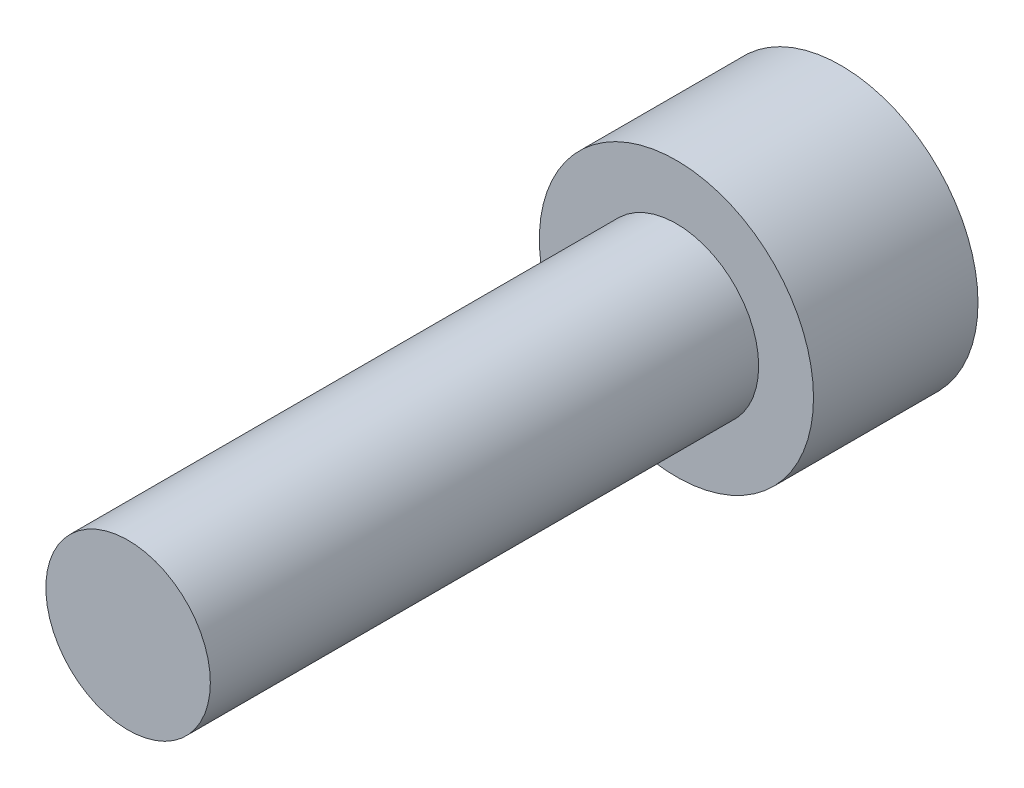
ISO-10303-21;
HEADER;
FILE_DESCRIPTION(('STEP AP214'),'2;1');
FILE_NAME('part.step','',(''),(''),'','','');
FILE_SCHEMA(('AUTOMOTIVE_DESIGN { 1 0 10303 214 1 1 1 1 }'));
ENDSEC;
DATA;
#1=APPLICATION_CONTEXT('core data for automotive mechanical design processes');
#2=APPLICATION_PROTOCOL_DEFINITION('international standard','automotive_design',2000,#1);
#3=PRODUCT_CONTEXT('',#1,'mechanical');
#4=PRODUCT('Part','Part','',(#3));
#5=PRODUCT_RELATED_PRODUCT_CATEGORY('part','',(#4));
#6=PRODUCT_DEFINITION_FORMATION('','',#4);
#7=PRODUCT_DEFINITION_CONTEXT('part definition',#1,'design');
#8=PRODUCT_DEFINITION('design','',#6,#7);
#9=PRODUCT_DEFINITION_SHAPE('','',#8);
#10=(LENGTH_UNIT() NAMED_UNIT(*) SI_UNIT(.MILLI.,.METRE.));
#11=(NAMED_UNIT(*) PLANE_ANGLE_UNIT() SI_UNIT($,.RADIAN.));
#12=(NAMED_UNIT(*) SI_UNIT($,.STERADIAN.) SOLID_ANGLE_UNIT());
#13=UNCERTAINTY_MEASURE_WITH_UNIT(LENGTH_MEASURE(1.E-05),#10,'distance_accuracy_value','');
#14=(GEOMETRIC_REPRESENTATION_CONTEXT(3) GLOBAL_UNCERTAINTY_ASSIGNED_CONTEXT((#13)) GLOBAL_UNIT_ASSIGNED_CONTEXT((#10,
#11,#12)) REPRESENTATION_CONTEXT('',''));
#15=CARTESIAN_POINT('',(0.,0.,0.));
#16=DIRECTION('',(0.,0.,1.));
#17=DIRECTION('',(1.,0.,0.));
#18=AXIS2_PLACEMENT_3D('',#15,#16,#17);
#19=CARTESIAN_POINT('',(0.,0.,6.));
#20=DIRECTION('',(0.,0.,1.));
#21=DIRECTION('',(1.,0.,0.));
#22=AXIS2_PLACEMENT_3D('',#19,#20,#21);
#23=PLANE('',#22);
#24=CARTESIAN_POINT('',(0.,0.,6.));
#25=DIRECTION('',(0.,0.,1.));
#26=DIRECTION('',(1.,0.,0.));
#27=AXIS2_PLACEMENT_3D('',#24,#25,#26);
#28=CIRCLE('',#27,5.);
#29=CARTESIAN_POINT('',(5.,0.,6.));
#30=VERTEX_POINT('',#29);
#31=EDGE_CURVE('E11',#30,#30,#28,.T.);
#32=ORIENTED_EDGE('',*,*,#31,.T.);
#33=EDGE_LOOP('',(#32));
#34=FACE_BOUND('',#33,.T.);
#35=CARTESIAN_POINT('',(0.,0.,6.));
#36=DIRECTION('',(0.,0.,1.));
#37=DIRECTION('',(1.,0.,0.));
#38=AXIS2_PLACEMENT_3D('',#35,#36,#37);
#39=CIRCLE('',#38,3.);
#40=CARTESIAN_POINT('',(3.,0.,6.));
#41=VERTEX_POINT('',#40);
#42=EDGE_CURVE('E139',#41,#41,#39,.T.);
#43=ORIENTED_EDGE('',*,*,#42,.F.);
#44=EDGE_LOOP('',(#43));
#45=FACE_BOUND('',#44,.T.);
#46=ADVANCED_FACE('F37',(#34,#45),#23,.T.);
#47=CARTESIAN_POINT('',(0.,0.,6.));
#48=DIRECTION('',(0.,0.,-1.));
#49=DIRECTION('',(-1.,0.,0.));
#50=AXIS2_PLACEMENT_3D('',#47,#48,#49);
#51=CYLINDRICAL_SURFACE('',#50,5.);
#52=ORIENTED_EDGE('',*,*,#31,.F.);
#53=EDGE_LOOP('',(#52));
#54=FACE_BOUND('',#53,.T.);
#55=CARTESIAN_POINT('',(0.,0.,0.));
#56=DIRECTION('',(0.,0.,1.));
#57=DIRECTION('',(1.,0.,0.));
#58=AXIS2_PLACEMENT_3D('',#55,#56,#57);
#59=CIRCLE('',#58,5.);
#60=CARTESIAN_POINT('',(5.,0.,0.));
#61=VERTEX_POINT('',#60);
#62=EDGE_CURVE('E41',#61,#61,#59,.T.);
#63=ORIENTED_EDGE('',*,*,#62,.T.);
#64=EDGE_LOOP('',(#63));
#65=FACE_BOUND('',#64,.T.);
#66=ADVANCED_FACE('F39',(#54,#65),#51,.T.);
#67=CARTESIAN_POINT('',(0.,0.,0.));
#68=DIRECTION('',(0.,0.,1.));
#69=DIRECTION('',(1.,0.,0.));
#70=AXIS2_PLACEMENT_3D('',#67,#68,#69);
#71=PLANE('',#70);
#72=DIRECTION('',(0.961310652096989,0.275466568143691,0.));
#73=VECTOR('',#72,1.);
#74=CARTESIAN_POINT('',(-2.44462819370027,2.36158950964695,0.));
#75=LINE('',#74,#73);
#76=CARTESIAN_POINT('',(-2.44462819370027,2.36158950964695,0.));
#77=VERTEX_POINT('',#76);
#78=CARTESIAN_POINT('',(0.822882411814956,3.29790487337557,0.));
#79=VERTEX_POINT('',#78);
#80=EDGE_CURVE('E126',#77,#79,#75,.T.);
#81=ORIENTED_EDGE('',*,*,#80,.F.);
#82=DIRECTION('',(0.242094280142741,0.970252729716422,0.));
#83=VECTOR('',#82,1.);
#84=CARTESIAN_POINT('',(-3.26751060551523,-0.936315363728624,0.));
#85=LINE('',#84,#83);
#86=CARTESIAN_POINT('',(-3.26751060551523,-0.936315363728624,0.));
#87=VERTEX_POINT('',#86);
#88=EDGE_CURVE('E52',#87,#77,#85,.T.);
#89=ORIENTED_EDGE('',*,*,#88,.F.);
#90=DIRECTION('',(-0.719216371954248,0.694786161572731,0.));
#91=VECTOR('',#90,1.);
#92=CARTESIAN_POINT('',(-0.822882411814958,-3.29790487337557,0.));
#93=LINE('',#92,#91);
#94=CARTESIAN_POINT('',(-0.822882411814958,-3.29790487337557,0.));
#95=VERTEX_POINT('',#94);
#96=EDGE_CURVE('E135',#95,#87,#93,.T.);
#97=ORIENTED_EDGE('',*,*,#96,.F.);
#98=DIRECTION('',(-0.961310652096989,-0.275466568143691,0.));
#99=VECTOR('',#98,1.);
#100=CARTESIAN_POINT('',(2.44462819370027,-2.36158950964695,0.));
#101=LINE('',#100,#99);
#102=CARTESIAN_POINT('',(2.44462819370027,-2.36158950964695,0.));
#103=VERTEX_POINT('',#102);
#104=EDGE_CURVE('E133',#103,#95,#101,.T.);
#105=ORIENTED_EDGE('',*,*,#104,.F.);
#106=DIRECTION('',(-0.242094280142741,-0.970252729716422,0.));
#107=VECTOR('',#106,1.);
#108=CARTESIAN_POINT('',(3.26751060551522,0.936315363728623,0.));
#109=LINE('',#108,#107);
#110=CARTESIAN_POINT('',(3.26751060551522,0.936315363728623,0.));
#111=VERTEX_POINT('',#110);
#112=EDGE_CURVE('E100',#111,#103,#109,.T.);
#113=ORIENTED_EDGE('',*,*,#112,.F.);
#114=DIRECTION('',(0.719216371954247,-0.694786161572731,0.));
#115=VECTOR('',#114,1.);
#116=CARTESIAN_POINT('',(0.822882411814956,3.29790487337557,0.));
#117=LINE('',#116,#115);
#118=EDGE_CURVE('E129',#79,#111,#117,.T.);
#119=ORIENTED_EDGE('',*,*,#118,.F.);
#120=EDGE_LOOP('',(#81,#89,#97,#105,#113,#119));
#121=FACE_BOUND('',#120,.T.);
#122=ORIENTED_EDGE('',*,*,#62,.F.);
#123=EDGE_LOOP('',(#122));
#124=FACE_BOUND('',#123,.T.);
#125=ADVANCED_FACE('F159',(#121,#124),#71,.F.);
#126=CARTESIAN_POINT('',(0.,0.,26.));
#127=DIRECTION('',(0.,0.,-1.));
#128=DIRECTION('',(-1.,0.,0.));
#129=AXIS2_PLACEMENT_3D('',#126,#127,#128);
#130=CYLINDRICAL_SURFACE('',#129,3.);
#131=CARTESIAN_POINT('',(0.,0.,26.));
#132=DIRECTION('',(0.,0.,1.));
#133=DIRECTION('',(1.,0.,0.));
#134=AXIS2_PLACEMENT_3D('',#131,#132,#133);
#135=CIRCLE('',#134,3.);
#136=CARTESIAN_POINT('',(3.,0.,26.));
#137=VERTEX_POINT('',#136);
#138=EDGE_CURVE('E145',#137,#137,#135,.T.);
#139=ORIENTED_EDGE('',*,*,#138,.F.);
#140=EDGE_LOOP('',(#139));
#141=FACE_BOUND('',#140,.T.);
#142=ORIENTED_EDGE('',*,*,#42,.T.);
#143=EDGE_LOOP('',(#142));
#144=FACE_BOUND('',#143,.T.);
#145=ADVANCED_FACE('F151',(#141,#144),#130,.T.);
#146=CARTESIAN_POINT('',(0.,0.,26.));
#147=DIRECTION('',(0.,0.,1.));
#148=DIRECTION('',(1.,0.,0.));
#149=AXIS2_PLACEMENT_3D('',#146,#147,#148);
#150=PLANE('',#149);
#151=ORIENTED_EDGE('',*,*,#138,.T.);
#152=EDGE_LOOP('',(#151));
#153=FACE_BOUND('',#152,.T.);
#154=ADVANCED_FACE('F168',(#153),#150,.T.);
#155=CARTESIAN_POINT('',(-3.26751060551523,-0.936315363728624,3.));
#156=DIRECTION('',(-0.970252729716422,0.242094280142741,0.));
#157=DIRECTION('',(-0.242094280142741,-0.970252729716422,0.));
#158=AXIS2_PLACEMENT_3D('',#155,#156,#157);
#159=PLANE('',#158);
#160=ORIENTED_EDGE('',*,*,#88,.T.);
#161=DIRECTION('',(0.,0.,-1.));
#162=VECTOR('',#161,1.);
#163=CARTESIAN_POINT('',(-2.44462819370027,2.36158950964695,3.));
#164=LINE('',#163,#162);
#165=CARTESIAN_POINT('',(-2.44462819370027,2.36158950964695,3.));
#166=VERTEX_POINT('',#165);
#167=EDGE_CURVE('E82',#166,#77,#164,.T.);
#168=ORIENTED_EDGE('',*,*,#167,.F.);
#169=DIRECTION('',(0.242094280142741,0.970252729716422,0.));
#170=VECTOR('',#169,1.);
#171=CARTESIAN_POINT('',(-3.26751060551523,-0.936315363728624,3.));
#172=LINE('',#171,#170);
#173=CARTESIAN_POINT('',(-3.26751060551523,-0.936315363728624,3.));
#174=VERTEX_POINT('',#173);
#175=EDGE_CURVE('E137',#174,#166,#172,.T.);
#176=ORIENTED_EDGE('',*,*,#175,.F.);
#177=DIRECTION('',(0.,0.,-1.));
#178=VECTOR('',#177,1.);
#179=CARTESIAN_POINT('',(-3.26751060551523,-0.936315363728624,3.));
#180=LINE('',#179,#178);
#181=EDGE_CURVE('E60',#174,#87,#180,.T.);
#182=ORIENTED_EDGE('',*,*,#181,.T.);
#183=EDGE_LOOP('',(#160,#168,#176,#182));
#184=FACE_BOUND('',#183,.T.);
#185=ADVANCED_FACE('F180',(#184),#159,.F.);
#186=CARTESIAN_POINT('',(-0.822882411814958,-3.29790487337557,3.));
#187=DIRECTION('',(-0.694786161572731,-0.719216371954248,0.));
#188=DIRECTION('',(0.719216371954248,-0.694786161572731,0.));
#189=AXIS2_PLACEMENT_3D('',#186,#187,#188);
#190=PLANE('',#189);
#191=ORIENTED_EDGE('',*,*,#96,.T.);
#192=ORIENTED_EDGE('',*,*,#181,.F.);
#193=DIRECTION('',(-0.719216371954248,0.694786161572731,0.));
#194=VECTOR('',#193,1.);
#195=CARTESIAN_POINT('',(-0.822882411814958,-3.29790487337557,3.));
#196=LINE('',#195,#194);
#197=CARTESIAN_POINT('',(-0.822882411814958,-3.29790487337557,3.));
#198=VERTEX_POINT('',#197);
#199=EDGE_CURVE('E112',#198,#174,#196,.T.);
#200=ORIENTED_EDGE('',*,*,#199,.F.);
#201=DIRECTION('',(0.,0.,-1.));
#202=VECTOR('',#201,1.);
#203=CARTESIAN_POINT('',(-0.822882411814958,-3.29790487337557,3.));
#204=LINE('',#203,#202);
#205=EDGE_CURVE('E104',#198,#95,#204,.T.);
#206=ORIENTED_EDGE('',*,*,#205,.T.);
#207=EDGE_LOOP('',(#191,#192,#200,#206));
#208=FACE_BOUND('',#207,.T.);
#209=ADVANCED_FACE('F182',(#208),#190,.F.);
#210=CARTESIAN_POINT('',(2.44462819370027,-2.36158950964695,3.));
#211=DIRECTION('',(0.275466568143691,-0.961310652096988,0.));
#212=DIRECTION('',(0.961310652096989,0.275466568143691,0.));
#213=AXIS2_PLACEMENT_3D('',#210,#211,#212);
#214=PLANE('',#213);
#215=ORIENTED_EDGE('',*,*,#104,.T.);
#216=ORIENTED_EDGE('',*,*,#205,.F.);
#217=DIRECTION('',(-0.961310652096989,-0.275466568143691,0.));
#218=VECTOR('',#217,1.);
#219=CARTESIAN_POINT('',(2.44462819370027,-2.36158950964695,3.));
#220=LINE('',#219,#218);
#221=CARTESIAN_POINT('',(2.44462819370027,-2.36158950964695,3.));
#222=VERTEX_POINT('',#221);
#223=EDGE_CURVE('E108',#222,#198,#220,.T.);
#224=ORIENTED_EDGE('',*,*,#223,.F.);
#225=DIRECTION('',(0.,0.,-1.));
#226=VECTOR('',#225,1.);
#227=CARTESIAN_POINT('',(2.44462819370027,-2.36158950964695,3.));
#228=LINE('',#227,#226);
#229=EDGE_CURVE('E93',#222,#103,#228,.T.);
#230=ORIENTED_EDGE('',*,*,#229,.T.);
#231=EDGE_LOOP('',(#215,#216,#224,#230));
#232=FACE_BOUND('',#231,.T.);
#233=ADVANCED_FACE('F109',(#232),#214,.F.);
#234=CARTESIAN_POINT('',(3.26751060551522,0.936315363728623,3.));
#235=DIRECTION('',(0.970252729716422,-0.242094280142741,0.));
#236=DIRECTION('',(0.242094280142741,0.970252729716422,0.));
#237=AXIS2_PLACEMENT_3D('',#234,#235,#236);
#238=PLANE('',#237);
#239=ORIENTED_EDGE('',*,*,#112,.T.);
#240=ORIENTED_EDGE('',*,*,#229,.F.);
#241=DIRECTION('',(-0.242094280142741,-0.970252729716422,0.));
#242=VECTOR('',#241,1.);
#243=CARTESIAN_POINT('',(3.26751060551522,0.936315363728623,3.));
#244=LINE('',#243,#242);
#245=CARTESIAN_POINT('',(3.26751060551522,0.936315363728623,3.));
#246=VERTEX_POINT('',#245);
#247=EDGE_CURVE('E97',#246,#222,#244,.T.);
#248=ORIENTED_EDGE('',*,*,#247,.F.);
#249=DIRECTION('',(0.,0.,-1.));
#250=VECTOR('',#249,1.);
#251=CARTESIAN_POINT('',(3.26751060551522,0.936315363728623,3.));
#252=LINE('',#251,#250);
#253=EDGE_CURVE('E105',#246,#111,#252,.T.);
#254=ORIENTED_EDGE('',*,*,#253,.T.);
#255=EDGE_LOOP('',(#239,#240,#248,#254));
#256=FACE_BOUND('',#255,.T.);
#257=ADVANCED_FACE('F95',(#256),#238,.F.);
#258=CARTESIAN_POINT('',(0.822882411814956,3.29790487337557,3.));
#259=DIRECTION('',(0.694786161572731,0.719216371954248,0.));
#260=DIRECTION('',(-0.719216371954248,0.694786161572731,0.));
#261=AXIS2_PLACEMENT_3D('',#258,#259,#260);
#262=PLANE('',#261);
#263=ORIENTED_EDGE('',*,*,#118,.T.);
#264=ORIENTED_EDGE('',*,*,#253,.F.);
#265=DIRECTION('',(0.719216371954247,-0.694786161572731,0.));
#266=VECTOR('',#265,1.);
#267=CARTESIAN_POINT('',(0.822882411814956,3.29790487337557,3.));
#268=LINE('',#267,#266);
#269=CARTESIAN_POINT('',(0.822882411814956,3.29790487337557,3.));
#270=VERTEX_POINT('',#269);
#271=EDGE_CURVE('E118',#270,#246,#268,.T.);
#272=ORIENTED_EDGE('',*,*,#271,.F.);
#273=DIRECTION('',(0.,0.,-1.));
#274=VECTOR('',#273,1.);
#275=CARTESIAN_POINT('',(0.822882411814956,3.29790487337557,3.));
#276=LINE('',#275,#274);
#277=EDGE_CURVE('E142',#270,#79,#276,.T.);
#278=ORIENTED_EDGE('',*,*,#277,.T.);
#279=EDGE_LOOP('',(#263,#264,#272,#278));
#280=FACE_BOUND('',#279,.T.);
#281=ADVANCED_FACE('F193',(#280),#262,.F.);
#282=CARTESIAN_POINT('',(-2.44462819370027,2.36158950964695,3.));
#283=DIRECTION('',(-0.275466568143691,0.961310652096988,0.));
#284=DIRECTION('',(-0.961310652096989,-0.275466568143691,0.));
#285=AXIS2_PLACEMENT_3D('',#282,#283,#284);
#286=PLANE('',#285);
#287=ORIENTED_EDGE('',*,*,#80,.T.);
#288=ORIENTED_EDGE('',*,*,#277,.F.);
#289=DIRECTION('',(0.961310652096989,0.275466568143691,0.));
#290=VECTOR('',#289,1.);
#291=CARTESIAN_POINT('',(-2.44462819370027,2.36158950964695,3.));
#292=LINE('',#291,#290);
#293=EDGE_CURVE('E120',#166,#270,#292,.T.);
#294=ORIENTED_EDGE('',*,*,#293,.F.);
#295=ORIENTED_EDGE('',*,*,#167,.T.);
#296=EDGE_LOOP('',(#287,#288,#294,#295));
#297=FACE_BOUND('',#296,.T.);
#298=ADVANCED_FACE('F178',(#297),#286,.F.);
#299=CARTESIAN_POINT('',(0.,0.,3.));
#300=DIRECTION('',(0.,0.,-1.));
#301=DIRECTION('',(-1.,0.,0.));
#302=AXIS2_PLACEMENT_3D('',#299,#300,#301);
#303=PLANE('',#302);
#304=ORIENTED_EDGE('',*,*,#175,.T.);
#305=ORIENTED_EDGE('',*,*,#293,.T.);
#306=ORIENTED_EDGE('',*,*,#271,.T.);
#307=ORIENTED_EDGE('',*,*,#247,.T.);
#308=ORIENTED_EDGE('',*,*,#223,.T.);
#309=ORIENTED_EDGE('',*,*,#199,.T.);
#310=EDGE_LOOP('',(#304,#305,#306,#307,#308,#309));
#311=FACE_BOUND('',#310,.T.);
#312=ADVANCED_FACE('F115',(#311),#303,.T.);
#313=CLOSED_SHELL('',(#46,#66,#125,#145,#154,#185,#209,#233,#257,#281,#298,#312));
#314=MANIFOLD_SOLID_BREP('B2',#313);
#315=ADVANCED_BREP_SHAPE_REPRESENTATION('',(#18,#314),#14);
#316=SHAPE_DEFINITION_REPRESENTATION(#9,#315);
ENDSEC;
END-ISO-10303-21;
